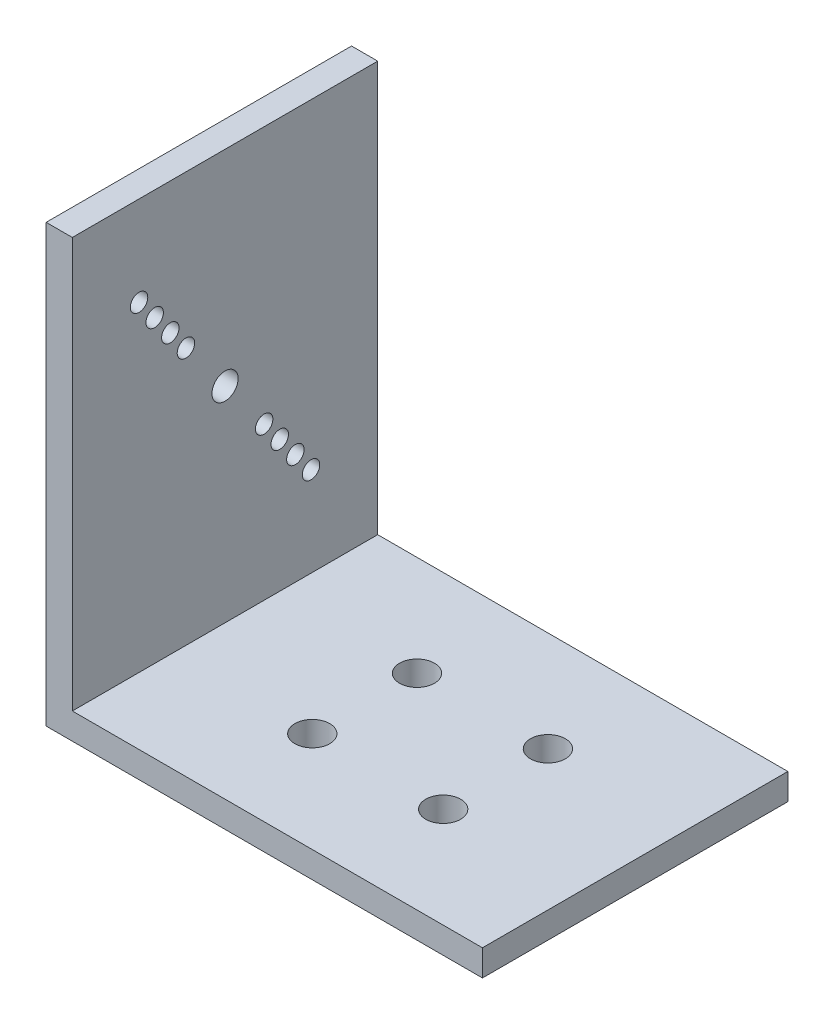
ISO-10303-21;
HEADER;
FILE_DESCRIPTION(('STEP AP214'),'2;1');
FILE_NAME('part.step','',(''),(''),'','','');
FILE_SCHEMA(('AUTOMOTIVE_DESIGN { 1 0 10303 214 1 1 1 1 }'));
ENDSEC;
DATA;
#1=APPLICATION_CONTEXT('core data for automotive mechanical design processes');
#2=APPLICATION_PROTOCOL_DEFINITION('international standard','automotive_design',2000,#1);
#3=PRODUCT_CONTEXT('',#1,'mechanical');
#4=PRODUCT('Part','Part','',(#3));
#5=PRODUCT_RELATED_PRODUCT_CATEGORY('part','',(#4));
#6=PRODUCT_DEFINITION_FORMATION('','',#4);
#7=PRODUCT_DEFINITION_CONTEXT('part definition',#1,'design');
#8=PRODUCT_DEFINITION('design','',#6,#7);
#9=PRODUCT_DEFINITION_SHAPE('','',#8);
#10=(LENGTH_UNIT() NAMED_UNIT(*) SI_UNIT(.MILLI.,.METRE.));
#11=(NAMED_UNIT(*) PLANE_ANGLE_UNIT() SI_UNIT($,.RADIAN.));
#12=(NAMED_UNIT(*) SI_UNIT($,.STERADIAN.) SOLID_ANGLE_UNIT());
#13=UNCERTAINTY_MEASURE_WITH_UNIT(LENGTH_MEASURE(1.E-05),#10,'distance_accuracy_value','');
#14=(GEOMETRIC_REPRESENTATION_CONTEXT(3) GLOBAL_UNCERTAINTY_ASSIGNED_CONTEXT((#13)) GLOBAL_UNIT_ASSIGNED_CONTEXT((#10,
#11,#12)) REPRESENTATION_CONTEXT('',''));
#15=CARTESIAN_POINT('',(0.,0.,0.));
#16=DIRECTION('',(0.,0.,1.));
#17=DIRECTION('',(1.,0.,0.));
#18=AXIS2_PLACEMENT_3D('',#15,#16,#17);
#19=CARTESIAN_POINT('',(0.,50.,35.));
#20=DIRECTION('',(0.,-1.,0.));
#21=DIRECTION('',(0.,0.,-1.));
#22=AXIS2_PLACEMENT_3D('',#19,#20,#21);
#23=PLANE('',#22);
#24=DIRECTION('',(-1.,0.,0.));
#25=VECTOR('',#24,1.);
#26=CARTESIAN_POINT('',(0.,50.,0.));
#27=LINE('',#26,#25);
#28=CARTESIAN_POINT('',(3.,50.,0.));
#29=VERTEX_POINT('',#28);
#30=CARTESIAN_POINT('',(0.,50.,0.));
#31=VERTEX_POINT('',#30);
#32=EDGE_CURVE('E122',#29,#31,#27,.T.);
#33=ORIENTED_EDGE('',*,*,#32,.T.);
#34=DIRECTION('',(0.,0.,-1.));
#35=VECTOR('',#34,1.);
#36=CARTESIAN_POINT('',(0.,50.,35.));
#37=LINE('',#36,#35);
#38=CARTESIAN_POINT('',(0.,50.,35.));
#39=VERTEX_POINT('',#38);
#40=EDGE_CURVE('E11',#39,#31,#37,.T.);
#41=ORIENTED_EDGE('',*,*,#40,.F.);
#42=DIRECTION('',(-1.,0.,0.));
#43=VECTOR('',#42,1.);
#44=CARTESIAN_POINT('',(0.,50.,35.));
#45=LINE('',#44,#43);
#46=CARTESIAN_POINT('',(3.,50.,35.));
#47=VERTEX_POINT('',#46);
#48=EDGE_CURVE('E133',#47,#39,#45,.T.);
#49=ORIENTED_EDGE('',*,*,#48,.F.);
#50=DIRECTION('',(0.,0.,-1.));
#51=VECTOR('',#50,1.);
#52=CARTESIAN_POINT('',(3.,50.,35.));
#53=LINE('',#52,#51);
#54=EDGE_CURVE('E118',#47,#29,#53,.T.);
#55=ORIENTED_EDGE('',*,*,#54,.T.);
#56=EDGE_LOOP('',(#33,#41,#49,#55));
#57=FACE_BOUND('',#56,.T.);
#58=ADVANCED_FACE('F38',(#57),#23,.F.);
#59=CARTESIAN_POINT('',(0.,50.,35.));
#60=DIRECTION('',(1.,0.,0.));
#61=DIRECTION('',(0.,0.,-1.));
#62=AXIS2_PLACEMENT_3D('',#59,#60,#61);
#63=PLANE('',#62);
#64=CARTESIAN_POINT('',(0.,20.484676672447,13.0205039050138));
#65=DIRECTION('',(1.,0.,0.));
#66=DIRECTION('',(0.,0.,-1.));
#67=AXIS2_PLACEMENT_3D('',#64,#65,#66);
#68=CIRCLE('',#67,1.);
#69=CARTESIAN_POINT('',(0.,20.484676672447,12.0205039050137));
#70=VERTEX_POINT('',#69);
#71=EDGE_CURVE('E346',#70,#70,#68,.T.);
#72=ORIENTED_EDGE('',*,*,#71,.T.);
#73=EDGE_LOOP('',(#72));
#74=FACE_BOUND('',#73,.T.);
#75=CARTESIAN_POINT('',(0.,32.515323327553,21.9794960949863));
#76=DIRECTION('',(1.,0.,0.));
#77=DIRECTION('',(0.,0.,-1.));
#78=AXIS2_PLACEMENT_3D('',#75,#76,#77);
#79=CIRCLE('',#78,1.);
#80=CARTESIAN_POINT('',(0.,32.515323327553,20.9794960949863));
#81=VERTEX_POINT('',#80);
#82=EDGE_CURVE('E348',#81,#81,#79,.T.);
#83=ORIENTED_EDGE('',*,*,#82,.T.);
#84=EDGE_LOOP('',(#83));
#85=FACE_BOUND('',#84,.T.);
#86=CARTESIAN_POINT('',(0.,34.9214526585742,23.7712945329808));
#87=DIRECTION('',(1.,0.,0.));
#88=DIRECTION('',(0.,0.,-1.));
#89=AXIS2_PLACEMENT_3D('',#86,#87,#88);
#90=CIRCLE('',#89,1.);
#91=CARTESIAN_POINT('',(0.,34.9214526585742,22.7712945329808));
#92=VERTEX_POINT('',#91);
#93=EDGE_CURVE('E354',#92,#92,#90,.T.);
#94=ORIENTED_EDGE('',*,*,#93,.T.);
#95=EDGE_LOOP('',(#94));
#96=FACE_BOUND('',#95,.T.);
#97=CARTESIAN_POINT('',(0.,37.3275819895954,25.5630929709753));
#98=DIRECTION('',(1.,0.,0.));
#99=DIRECTION('',(0.,0.,-1.));
#100=AXIS2_PLACEMENT_3D('',#97,#98,#99);
#101=CIRCLE('',#100,1.);
#102=CARTESIAN_POINT('',(0.,37.3275819895954,24.5630929709753));
#103=VERTEX_POINT('',#102);
#104=EDGE_CURVE('E397',#103,#103,#101,.T.);
#105=ORIENTED_EDGE('',*,*,#104,.T.);
#106=EDGE_LOOP('',(#105));
#107=FACE_BOUND('',#106,.T.);
#108=CARTESIAN_POINT('',(0.,39.7337113206165,27.3548914089698));
#109=DIRECTION('',(1.,0.,0.));
#110=DIRECTION('',(0.,0.,-1.));
#111=AXIS2_PLACEMENT_3D('',#108,#109,#110);
#112=CIRCLE('',#111,1.);
#113=CARTESIAN_POINT('',(0.,39.7337113206165,26.3548914089698));
#114=VERTEX_POINT('',#113);
#115=EDGE_CURVE('E400',#114,#114,#112,.T.);
#116=ORIENTED_EDGE('',*,*,#115,.T.);
#117=EDGE_LOOP('',(#116));
#118=FACE_BOUND('',#117,.T.);
#119=CARTESIAN_POINT('',(0.,18.0785473414259,11.2287054670193));
#120=DIRECTION('',(1.,0.,0.));
#121=DIRECTION('',(0.,0.,-1.));
#122=AXIS2_PLACEMENT_3D('',#119,#120,#121);
#123=CIRCLE('',#122,1.);
#124=CARTESIAN_POINT('',(0.,18.0785473414259,10.2287054670193));
#125=VERTEX_POINT('',#124);
#126=EDGE_CURVE('E403',#125,#125,#123,.T.);
#127=ORIENTED_EDGE('',*,*,#126,.T.);
#128=EDGE_LOOP('',(#127));
#129=FACE_BOUND('',#128,.T.);
#130=CARTESIAN_POINT('',(0.,15.6724180104047,9.43690702902475));
#131=DIRECTION('',(1.,0.,0.));
#132=DIRECTION('',(0.,0.,-1.));
#133=AXIS2_PLACEMENT_3D('',#130,#131,#132);
#134=CIRCLE('',#133,1.);
#135=CARTESIAN_POINT('',(0.,15.6724180104047,8.43690702902476));
#136=VERTEX_POINT('',#135);
#137=EDGE_CURVE('E406',#136,#136,#134,.T.);
#138=ORIENTED_EDGE('',*,*,#137,.T.);
#139=EDGE_LOOP('',(#138));
#140=FACE_BOUND('',#139,.T.);
#141=CARTESIAN_POINT('',(0.,13.2662886793835,7.64510859103025));
#142=DIRECTION('',(1.,0.,0.));
#143=DIRECTION('',(0.,0.,-1.));
#144=AXIS2_PLACEMENT_3D('',#141,#142,#143);
#145=CIRCLE('',#144,1.);
#146=CARTESIAN_POINT('',(0.,13.2662886793835,6.64510859103025));
#147=VERTEX_POINT('',#146);
#148=EDGE_CURVE('E409',#147,#147,#145,.T.);
#149=ORIENTED_EDGE('',*,*,#148,.T.);
#150=EDGE_LOOP('',(#149));
#151=FACE_BOUND('',#150,.T.);
#152=CARTESIAN_POINT('',(0.,26.5,17.5));
#153=DIRECTION('',(1.,0.,0.));
#154=DIRECTION('',(0.,0.,-1.));
#155=AXIS2_PLACEMENT_3D('',#152,#153,#154);
#156=CIRCLE('',#155,1.5);
#157=CARTESIAN_POINT('',(0.,26.5,16.));
#158=VERTEX_POINT('',#157);
#159=EDGE_CURVE('E412',#158,#158,#156,.T.);
#160=ORIENTED_EDGE('',*,*,#159,.T.);
#161=EDGE_LOOP('',(#160));
#162=FACE_BOUND('',#161,.T.);
#163=DIRECTION('',(0.,-1.,0.));
#164=VECTOR('',#163,1.);
#165=CARTESIAN_POINT('',(0.,50.,0.));
#166=LINE('',#165,#164);
#167=CARTESIAN_POINT('',(0.,0.,0.));
#168=VERTEX_POINT('',#167);
#169=EDGE_CURVE('E125',#31,#168,#166,.T.);
#170=ORIENTED_EDGE('',*,*,#169,.T.);
#171=DIRECTION('',(0.,0.,-1.));
#172=VECTOR('',#171,1.);
#173=CARTESIAN_POINT('',(0.,0.,35.));
#174=LINE('',#173,#172);
#175=CARTESIAN_POINT('',(0.,0.,35.));
#176=VERTEX_POINT('',#175);
#177=EDGE_CURVE('E46',#176,#168,#174,.T.);
#178=ORIENTED_EDGE('',*,*,#177,.F.);
#179=DIRECTION('',(0.,-1.,0.));
#180=VECTOR('',#179,1.);
#181=CARTESIAN_POINT('',(0.,50.,35.));
#182=LINE('',#181,#180);
#183=EDGE_CURVE('E91',#39,#176,#182,.T.);
#184=ORIENTED_EDGE('',*,*,#183,.F.);
#185=ORIENTED_EDGE('',*,*,#40,.T.);
#186=EDGE_LOOP('',(#170,#178,#184,#185));
#187=FACE_BOUND('',#186,.T.);
#188=ADVANCED_FACE('F160',(#74,#85,#96,#107,#118,#129,#140,#151,#162,#187),#63,.F.);
#189=CARTESIAN_POINT('',(0.,0.,35.));
#190=DIRECTION('',(0.,1.,0.));
#191=DIRECTION('',(0.,0.,1.));
#192=AXIS2_PLACEMENT_3D('',#189,#190,#191);
#193=PLANE('',#192);
#194=CARTESIAN_POINT('',(19.,0.,23.5));
#195=DIRECTION('',(0.,1.,0.));
#196=DIRECTION('',(0.,0.,1.));
#197=AXIS2_PLACEMENT_3D('',#194,#195,#196);
#198=CIRCLE('',#197,2.);
#199=CARTESIAN_POINT('',(19.,0.,25.5));
#200=VERTEX_POINT('',#199);
#201=EDGE_CURVE('E126',#200,#200,#198,.T.);
#202=ORIENTED_EDGE('',*,*,#201,.T.);
#203=EDGE_LOOP('',(#202));
#204=FACE_BOUND('',#203,.T.);
#205=CARTESIAN_POINT('',(34.,0.,23.5));
#206=DIRECTION('',(0.,1.,0.));
#207=DIRECTION('',(0.,0.,1.));
#208=AXIS2_PLACEMENT_3D('',#205,#206,#207);
#209=CIRCLE('',#208,2.);
#210=CARTESIAN_POINT('',(34.,0.,25.5));
#211=VERTEX_POINT('',#210);
#212=EDGE_CURVE('E372',#211,#211,#209,.T.);
#213=ORIENTED_EDGE('',*,*,#212,.T.);
#214=EDGE_LOOP('',(#213));
#215=FACE_BOUND('',#214,.T.);
#216=CARTESIAN_POINT('',(34.,0.,11.5));
#217=DIRECTION('',(0.,1.,0.));
#218=DIRECTION('',(0.,0.,1.));
#219=AXIS2_PLACEMENT_3D('',#216,#217,#218);
#220=CIRCLE('',#219,2.);
#221=CARTESIAN_POINT('',(34.,0.,13.5));
#222=VERTEX_POINT('',#221);
#223=EDGE_CURVE('E369',#222,#222,#220,.T.);
#224=ORIENTED_EDGE('',*,*,#223,.T.);
#225=EDGE_LOOP('',(#224));
#226=FACE_BOUND('',#225,.T.);
#227=CARTESIAN_POINT('',(19.,0.,11.5));
#228=DIRECTION('',(0.,1.,0.));
#229=DIRECTION('',(0.,0.,1.));
#230=AXIS2_PLACEMENT_3D('',#227,#228,#229);
#231=CIRCLE('',#230,2.00000000000001);
#232=CARTESIAN_POINT('',(19.,0.,13.5));
#233=VERTEX_POINT('',#232);
#234=EDGE_CURVE('E366',#233,#233,#231,.T.);
#235=ORIENTED_EDGE('',*,*,#234,.T.);
#236=EDGE_LOOP('',(#235));
#237=FACE_BOUND('',#236,.T.);
#238=DIRECTION('',(1.,0.,0.));
#239=VECTOR('',#238,1.);
#240=CARTESIAN_POINT('',(0.,0.,0.));
#241=LINE('',#240,#239);
#242=CARTESIAN_POINT('',(50.,0.,0.));
#243=VERTEX_POINT('',#242);
#244=EDGE_CURVE('E128',#168,#243,#241,.T.);
#245=ORIENTED_EDGE('',*,*,#244,.T.);
#246=DIRECTION('',(0.,0.,-1.));
#247=VECTOR('',#246,1.);
#248=CARTESIAN_POINT('',(50.,0.,35.));
#249=LINE('',#248,#247);
#250=CARTESIAN_POINT('',(50.,0.,35.));
#251=VERTEX_POINT('',#250);
#252=EDGE_CURVE('E113',#251,#243,#249,.T.);
#253=ORIENTED_EDGE('',*,*,#252,.F.);
#254=DIRECTION('',(1.,0.,0.));
#255=VECTOR('',#254,1.);
#256=CARTESIAN_POINT('',(0.,0.,35.));
#257=LINE('',#256,#255);
#258=EDGE_CURVE('E104',#176,#251,#257,.T.);
#259=ORIENTED_EDGE('',*,*,#258,.F.);
#260=ORIENTED_EDGE('',*,*,#177,.T.);
#261=EDGE_LOOP('',(#245,#253,#259,#260));
#262=FACE_BOUND('',#261,.T.);
#263=ADVANCED_FACE('F139',(#204,#215,#226,#237,#262),#193,.F.);
#264=CARTESIAN_POINT('',(50.,0.,35.));
#265=DIRECTION('',(-1.,0.,0.));
#266=DIRECTION('',(0.,0.,1.));
#267=AXIS2_PLACEMENT_3D('',#264,#265,#266);
#268=PLANE('',#267);
#269=DIRECTION('',(0.,1.,0.));
#270=VECTOR('',#269,1.);
#271=CARTESIAN_POINT('',(50.,0.,0.));
#272=LINE('',#271,#270);
#273=CARTESIAN_POINT('',(50.,3.,0.));
#274=VERTEX_POINT('',#273);
#275=EDGE_CURVE('E112',#243,#274,#272,.T.);
#276=ORIENTED_EDGE('',*,*,#275,.T.);
#277=DIRECTION('',(0.,0.,-1.));
#278=VECTOR('',#277,1.);
#279=CARTESIAN_POINT('',(50.,3.,35.));
#280=LINE('',#279,#278);
#281=CARTESIAN_POINT('',(50.,3.,35.));
#282=VERTEX_POINT('',#281);
#283=EDGE_CURVE('E109',#282,#274,#280,.T.);
#284=ORIENTED_EDGE('',*,*,#283,.F.);
#285=DIRECTION('',(0.,1.,0.));
#286=VECTOR('',#285,1.);
#287=CARTESIAN_POINT('',(50.,0.,35.));
#288=LINE('',#287,#286);
#289=EDGE_CURVE('E98',#251,#282,#288,.T.);
#290=ORIENTED_EDGE('',*,*,#289,.F.);
#291=ORIENTED_EDGE('',*,*,#252,.T.);
#292=EDGE_LOOP('',(#276,#284,#290,#291));
#293=FACE_BOUND('',#292,.T.);
#294=ADVANCED_FACE('F110',(#293),#268,.F.);
#295=CARTESIAN_POINT('',(3.,3.,35.));
#296=DIRECTION('',(0.,-1.,0.));
#297=DIRECTION('',(0.,0.,-1.));
#298=AXIS2_PLACEMENT_3D('',#295,#296,#297);
#299=PLANE('',#298);
#300=CARTESIAN_POINT('',(19.,3.,23.5));
#301=DIRECTION('',(0.,1.,0.));
#302=DIRECTION('',(0.,0.,1.));
#303=AXIS2_PLACEMENT_3D('',#300,#301,#302);
#304=CIRCLE('',#303,2.);
#305=CARTESIAN_POINT('',(19.,3.,25.5));
#306=VERTEX_POINT('',#305);
#307=EDGE_CURVE('E347',#306,#306,#304,.T.);
#308=ORIENTED_EDGE('',*,*,#307,.F.);
#309=EDGE_LOOP('',(#308));
#310=FACE_BOUND('',#309,.T.);
#311=CARTESIAN_POINT('',(34.,3.,23.5));
#312=DIRECTION('',(0.,1.,0.));
#313=DIRECTION('',(0.,0.,1.));
#314=AXIS2_PLACEMENT_3D('',#311,#312,#313);
#315=CIRCLE('',#314,2.);
#316=CARTESIAN_POINT('',(34.,3.,25.5));
#317=VERTEX_POINT('',#316);
#318=EDGE_CURVE('E351',#317,#317,#315,.T.);
#319=ORIENTED_EDGE('',*,*,#318,.F.);
#320=EDGE_LOOP('',(#319));
#321=FACE_BOUND('',#320,.T.);
#322=CARTESIAN_POINT('',(34.,3.,11.5));
#323=DIRECTION('',(0.,1.,0.));
#324=DIRECTION('',(0.,0.,1.));
#325=AXIS2_PLACEMENT_3D('',#322,#323,#324);
#326=CIRCLE('',#325,2.);
#327=CARTESIAN_POINT('',(34.,3.,13.5));
#328=VERTEX_POINT('',#327);
#329=EDGE_CURVE('E358',#328,#328,#326,.T.);
#330=ORIENTED_EDGE('',*,*,#329,.F.);
#331=EDGE_LOOP('',(#330));
#332=FACE_BOUND('',#331,.T.);
#333=CARTESIAN_POINT('',(19.,3.,11.5));
#334=DIRECTION('',(0.,1.,0.));
#335=DIRECTION('',(0.,0.,1.));
#336=AXIS2_PLACEMENT_3D('',#333,#334,#335);
#337=CIRCLE('',#336,2.00000000000001);
#338=CARTESIAN_POINT('',(19.,3.,13.5));
#339=VERTEX_POINT('',#338);
#340=EDGE_CURVE('E361',#339,#339,#337,.T.);
#341=ORIENTED_EDGE('',*,*,#340,.F.);
#342=EDGE_LOOP('',(#341));
#343=FACE_BOUND('',#342,.T.);
#344=DIRECTION('',(-1.,0.,0.));
#345=VECTOR('',#344,1.);
#346=CARTESIAN_POINT('',(3.,3.,0.));
#347=LINE('',#346,#345);
#348=CARTESIAN_POINT('',(3.,3.,0.));
#349=VERTEX_POINT('',#348);
#350=EDGE_CURVE('E77',#274,#349,#347,.T.);
#351=ORIENTED_EDGE('',*,*,#350,.T.);
#352=DIRECTION('',(0.,0.,-1.));
#353=VECTOR('',#352,1.);
#354=CARTESIAN_POINT('',(3.,3.,35.));
#355=LINE('',#354,#353);
#356=CARTESIAN_POINT('',(3.,3.,35.));
#357=VERTEX_POINT('',#356);
#358=EDGE_CURVE('E114',#357,#349,#355,.T.);
#359=ORIENTED_EDGE('',*,*,#358,.F.);
#360=DIRECTION('',(-1.,0.,0.));
#361=VECTOR('',#360,1.);
#362=CARTESIAN_POINT('',(3.,3.,35.));
#363=LINE('',#362,#361);
#364=EDGE_CURVE('E102',#282,#357,#363,.T.);
#365=ORIENTED_EDGE('',*,*,#364,.F.);
#366=ORIENTED_EDGE('',*,*,#283,.T.);
#367=EDGE_LOOP('',(#351,#359,#365,#366));
#368=FACE_BOUND('',#367,.T.);
#369=ADVANCED_FACE('F116',(#310,#321,#332,#343,#368),#299,.F.);
#370=CARTESIAN_POINT('',(3.,50.,35.));
#371=DIRECTION('',(-1.,0.,0.));
#372=DIRECTION('',(0.,0.,1.));
#373=AXIS2_PLACEMENT_3D('',#370,#371,#372);
#374=PLANE('',#373);
#375=CARTESIAN_POINT('',(3.,20.484676672447,13.0205039050138));
#376=DIRECTION('',(1.,0.,0.));
#377=DIRECTION('',(0.,0.,-1.));
#378=AXIS2_PLACEMENT_3D('',#375,#376,#377);
#379=CIRCLE('',#378,1.);
#380=CARTESIAN_POINT('',(3.,20.484676672447,12.0205039050137));
#381=VERTEX_POINT('',#380);
#382=EDGE_CURVE('E344',#381,#381,#379,.T.);
#383=ORIENTED_EDGE('',*,*,#382,.F.);
#384=EDGE_LOOP('',(#383));
#385=FACE_BOUND('',#384,.T.);
#386=CARTESIAN_POINT('',(3.,32.515323327553,21.9794960949863));
#387=DIRECTION('',(1.,0.,0.));
#388=DIRECTION('',(0.,0.,-1.));
#389=AXIS2_PLACEMENT_3D('',#386,#387,#388);
#390=CIRCLE('',#389,1.);
#391=CARTESIAN_POINT('',(3.,32.515323327553,20.9794960949863));
#392=VERTEX_POINT('',#391);
#393=EDGE_CURVE('E425',#392,#392,#390,.T.);
#394=ORIENTED_EDGE('',*,*,#393,.F.);
#395=EDGE_LOOP('',(#394));
#396=FACE_BOUND('',#395,.T.);
#397=CARTESIAN_POINT('',(3.,34.9214526585742,23.7712945329808));
#398=DIRECTION('',(1.,0.,0.));
#399=DIRECTION('',(0.,0.,-1.));
#400=AXIS2_PLACEMENT_3D('',#397,#398,#399);
#401=CIRCLE('',#400,1.);
#402=CARTESIAN_POINT('',(3.,34.9214526585742,22.7712945329808));
#403=VERTEX_POINT('',#402);
#404=EDGE_CURVE('E421',#403,#403,#401,.T.);
#405=ORIENTED_EDGE('',*,*,#404,.F.);
#406=EDGE_LOOP('',(#405));
#407=FACE_BOUND('',#406,.T.);
#408=CARTESIAN_POINT('',(3.,37.3275819895954,25.5630929709753));
#409=DIRECTION('',(1.,0.,0.));
#410=DIRECTION('',(0.,0.,-1.));
#411=AXIS2_PLACEMENT_3D('',#408,#409,#410);
#412=CIRCLE('',#411,1.);
#413=CARTESIAN_POINT('',(3.,37.3275819895954,24.5630929709753));
#414=VERTEX_POINT('',#413);
#415=EDGE_CURVE('E418',#414,#414,#412,.T.);
#416=ORIENTED_EDGE('',*,*,#415,.F.);
#417=EDGE_LOOP('',(#416));
#418=FACE_BOUND('',#417,.T.);
#419=CARTESIAN_POINT('',(3.,39.7337113206165,27.3548914089698));
#420=DIRECTION('',(1.,0.,0.));
#421=DIRECTION('',(0.,0.,-1.));
#422=AXIS2_PLACEMENT_3D('',#419,#420,#421);
#423=CIRCLE('',#422,1.);
#424=CARTESIAN_POINT('',(3.,39.7337113206165,26.3548914089698));
#425=VERTEX_POINT('',#424);
#426=EDGE_CURVE('E422',#425,#425,#423,.T.);
#427=ORIENTED_EDGE('',*,*,#426,.F.);
#428=EDGE_LOOP('',(#427));
#429=FACE_BOUND('',#428,.T.);
#430=CARTESIAN_POINT('',(3.,18.0785473414259,11.2287054670193));
#431=DIRECTION('',(1.,0.,0.));
#432=DIRECTION('',(0.,0.,-1.));
#433=AXIS2_PLACEMENT_3D('',#430,#431,#432);
#434=CIRCLE('',#433,1.);
#435=CARTESIAN_POINT('',(3.,18.0785473414259,10.2287054670193));
#436=VERTEX_POINT('',#435);
#437=EDGE_CURVE('E435',#436,#436,#434,.T.);
#438=ORIENTED_EDGE('',*,*,#437,.F.);
#439=EDGE_LOOP('',(#438));
#440=FACE_BOUND('',#439,.T.);
#441=CARTESIAN_POINT('',(3.,15.6724180104047,9.43690702902475));
#442=DIRECTION('',(1.,0.,0.));
#443=DIRECTION('',(0.,0.,-1.));
#444=AXIS2_PLACEMENT_3D('',#441,#442,#443);
#445=CIRCLE('',#444,1.);
#446=CARTESIAN_POINT('',(3.,15.6724180104047,8.43690702902476));
#447=VERTEX_POINT('',#446);
#448=EDGE_CURVE('E432',#447,#447,#445,.T.);
#449=ORIENTED_EDGE('',*,*,#448,.F.);
#450=EDGE_LOOP('',(#449));
#451=FACE_BOUND('',#450,.T.);
#452=CARTESIAN_POINT('',(3.,13.2662886793835,7.64510859103025));
#453=DIRECTION('',(1.,0.,0.));
#454=DIRECTION('',(0.,0.,-1.));
#455=AXIS2_PLACEMENT_3D('',#452,#453,#454);
#456=CIRCLE('',#455,1.);
#457=CARTESIAN_POINT('',(3.,13.2662886793835,6.64510859103025));
#458=VERTEX_POINT('',#457);
#459=EDGE_CURVE('E429',#458,#458,#456,.T.);
#460=ORIENTED_EDGE('',*,*,#459,.F.);
#461=EDGE_LOOP('',(#460));
#462=FACE_BOUND('',#461,.T.);
#463=CARTESIAN_POINT('',(3.,26.5,17.5));
#464=DIRECTION('',(1.,0.,0.));
#465=DIRECTION('',(0.,0.,-1.));
#466=AXIS2_PLACEMENT_3D('',#463,#464,#465);
#467=CIRCLE('',#466,1.5);
#468=CARTESIAN_POINT('',(3.,26.5,16.));
#469=VERTEX_POINT('',#468);
#470=EDGE_CURVE('E415',#469,#469,#467,.T.);
#471=ORIENTED_EDGE('',*,*,#470,.F.);
#472=EDGE_LOOP('',(#471));
#473=FACE_BOUND('',#472,.T.);
#474=DIRECTION('',(0.,1.,0.));
#475=VECTOR('',#474,1.);
#476=CARTESIAN_POINT('',(3.,50.,0.));
#477=LINE('',#476,#475);
#478=EDGE_CURVE('E83',#349,#29,#477,.T.);
#479=ORIENTED_EDGE('',*,*,#478,.T.);
#480=ORIENTED_EDGE('',*,*,#54,.F.);
#481=DIRECTION('',(0.,1.,0.));
#482=VECTOR('',#481,1.);
#483=CARTESIAN_POINT('',(3.,50.,35.));
#484=LINE('',#483,#482);
#485=EDGE_CURVE('E54',#357,#47,#484,.T.);
#486=ORIENTED_EDGE('',*,*,#485,.F.);
#487=ORIENTED_EDGE('',*,*,#358,.T.);
#488=EDGE_LOOP('',(#479,#480,#486,#487));
#489=FACE_BOUND('',#488,.T.);
#490=ADVANCED_FACE('F146',(#385,#396,#407,#418,#429,#440,#451,#462,#473,#489),#374,.F.);
#491=CARTESIAN_POINT('',(0.,0.,35.));
#492=DIRECTION('',(0.,0.,-1.));
#493=DIRECTION('',(-1.,0.,0.));
#494=AXIS2_PLACEMENT_3D('',#491,#492,#493);
#495=PLANE('',#494);
#496=ORIENTED_EDGE('',*,*,#48,.T.);
#497=ORIENTED_EDGE('',*,*,#183,.T.);
#498=ORIENTED_EDGE('',*,*,#258,.T.);
#499=ORIENTED_EDGE('',*,*,#289,.T.);
#500=ORIENTED_EDGE('',*,*,#364,.T.);
#501=ORIENTED_EDGE('',*,*,#485,.T.);
#502=EDGE_LOOP('',(#496,#497,#498,#499,#500,#501));
#503=FACE_BOUND('',#502,.T.);
#504=ADVANCED_FACE('F100',(#503),#495,.F.);
#505=CARTESIAN_POINT('',(0.,0.,0.));
#506=DIRECTION('',(0.,0.,-1.));
#507=DIRECTION('',(-1.,0.,0.));
#508=AXIS2_PLACEMENT_3D('',#505,#506,#507);
#509=PLANE('',#508);
#510=ORIENTED_EDGE('',*,*,#32,.F.);
#511=ORIENTED_EDGE('',*,*,#478,.F.);
#512=ORIENTED_EDGE('',*,*,#350,.F.);
#513=ORIENTED_EDGE('',*,*,#275,.F.);
#514=ORIENTED_EDGE('',*,*,#244,.F.);
#515=ORIENTED_EDGE('',*,*,#169,.F.);
#516=EDGE_LOOP('',(#510,#511,#512,#513,#514,#515));
#517=FACE_BOUND('',#516,.T.);
#518=ADVANCED_FACE('F142',(#517),#509,.T.);
#519=CARTESIAN_POINT('',(19.,-47.,11.5));
#520=DIRECTION('',(0.,1.,0.));
#521=DIRECTION('',(0.,0.,1.));
#522=AXIS2_PLACEMENT_3D('',#519,#520,#521);
#523=CYLINDRICAL_SURFACE('',#522,2.00000000000001);
#524=ORIENTED_EDGE('',*,*,#340,.T.);
#525=EDGE_LOOP('',(#524));
#526=FACE_BOUND('',#525,.T.);
#527=ORIENTED_EDGE('',*,*,#234,.F.);
#528=EDGE_LOOP('',(#527));
#529=FACE_BOUND('',#528,.T.);
#530=ADVANCED_FACE('F192',(#526,#529),#523,.F.);
#531=CARTESIAN_POINT('',(34.,-47.,11.5));
#532=DIRECTION('',(0.,1.,0.));
#533=DIRECTION('',(0.,0.,1.));
#534=AXIS2_PLACEMENT_3D('',#531,#532,#533);
#535=CYLINDRICAL_SURFACE('',#534,2.);
#536=ORIENTED_EDGE('',*,*,#329,.T.);
#537=EDGE_LOOP('',(#536));
#538=FACE_BOUND('',#537,.T.);
#539=ORIENTED_EDGE('',*,*,#223,.F.);
#540=EDGE_LOOP('',(#539));
#541=FACE_BOUND('',#540,.T.);
#542=ADVANCED_FACE('F197',(#538,#541),#535,.F.);
#543=CARTESIAN_POINT('',(34.,-47.,23.5));
#544=DIRECTION('',(0.,1.,0.));
#545=DIRECTION('',(0.,0.,1.));
#546=AXIS2_PLACEMENT_3D('',#543,#544,#545);
#547=CYLINDRICAL_SURFACE('',#546,2.);
#548=ORIENTED_EDGE('',*,*,#318,.T.);
#549=EDGE_LOOP('',(#548));
#550=FACE_BOUND('',#549,.T.);
#551=ORIENTED_EDGE('',*,*,#212,.F.);
#552=EDGE_LOOP('',(#551));
#553=FACE_BOUND('',#552,.T.);
#554=ADVANCED_FACE('F209',(#550,#553),#547,.F.);
#555=CARTESIAN_POINT('',(19.,-47.,23.5));
#556=DIRECTION('',(0.,1.,0.));
#557=DIRECTION('',(0.,0.,1.));
#558=AXIS2_PLACEMENT_3D('',#555,#556,#557);
#559=CYLINDRICAL_SURFACE('',#558,2.);
#560=ORIENTED_EDGE('',*,*,#307,.T.);
#561=EDGE_LOOP('',(#560));
#562=FACE_BOUND('',#561,.T.);
#563=ORIENTED_EDGE('',*,*,#201,.F.);
#564=EDGE_LOOP('',(#563));
#565=FACE_BOUND('',#564,.T.);
#566=ADVANCED_FACE('F219',(#562,#565),#559,.F.);
#567=CARTESIAN_POINT('',(-47.,26.5,17.5));
#568=DIRECTION('',(1.,0.,0.));
#569=DIRECTION('',(0.,0.,-1.));
#570=AXIS2_PLACEMENT_3D('',#567,#568,#569);
#571=CYLINDRICAL_SURFACE('',#570,1.5);
#572=ORIENTED_EDGE('',*,*,#470,.T.);
#573=EDGE_LOOP('',(#572));
#574=FACE_BOUND('',#573,.T.);
#575=ORIENTED_EDGE('',*,*,#159,.F.);
#576=EDGE_LOOP('',(#575));
#577=FACE_BOUND('',#576,.T.);
#578=ADVANCED_FACE('F228',(#574,#577),#571,.F.);
#579=CARTESIAN_POINT('',(-47.,13.2662886793835,7.64510859103025));
#580=DIRECTION('',(1.,0.,0.));
#581=DIRECTION('',(0.,0.,-1.));
#582=AXIS2_PLACEMENT_3D('',#579,#580,#581);
#583=CYLINDRICAL_SURFACE('',#582,1.);
#584=ORIENTED_EDGE('',*,*,#459,.T.);
#585=EDGE_LOOP('',(#584));
#586=FACE_BOUND('',#585,.T.);
#587=ORIENTED_EDGE('',*,*,#148,.F.);
#588=EDGE_LOOP('',(#587));
#589=FACE_BOUND('',#588,.T.);
#590=ADVANCED_FACE('F250',(#586,#589),#583,.F.);
#591=CARTESIAN_POINT('',(-47.,15.6724180104047,9.43690702902475));
#592=DIRECTION('',(1.,0.,0.));
#593=DIRECTION('',(0.,0.,-1.));
#594=AXIS2_PLACEMENT_3D('',#591,#592,#593);
#595=CYLINDRICAL_SURFACE('',#594,1.);
#596=ORIENTED_EDGE('',*,*,#448,.T.);
#597=EDGE_LOOP('',(#596));
#598=FACE_BOUND('',#597,.T.);
#599=ORIENTED_EDGE('',*,*,#137,.F.);
#600=EDGE_LOOP('',(#599));
#601=FACE_BOUND('',#600,.T.);
#602=ADVANCED_FACE('F260',(#598,#601),#595,.F.);
#603=CARTESIAN_POINT('',(-47.,18.0785473414259,11.2287054670193));
#604=DIRECTION('',(1.,0.,0.));
#605=DIRECTION('',(0.,0.,-1.));
#606=AXIS2_PLACEMENT_3D('',#603,#604,#605);
#607=CYLINDRICAL_SURFACE('',#606,1.);
#608=ORIENTED_EDGE('',*,*,#437,.T.);
#609=EDGE_LOOP('',(#608));
#610=FACE_BOUND('',#609,.T.);
#611=ORIENTED_EDGE('',*,*,#126,.F.);
#612=EDGE_LOOP('',(#611));
#613=FACE_BOUND('',#612,.T.);
#614=ADVANCED_FACE('F270',(#610,#613),#607,.F.);
#615=CARTESIAN_POINT('',(-47.,39.7337113206165,27.3548914089698));
#616=DIRECTION('',(1.,0.,0.));
#617=DIRECTION('',(0.,0.,-1.));
#618=AXIS2_PLACEMENT_3D('',#615,#616,#617);
#619=CYLINDRICAL_SURFACE('',#618,1.);
#620=ORIENTED_EDGE('',*,*,#426,.T.);
#621=EDGE_LOOP('',(#620));
#622=FACE_BOUND('',#621,.T.);
#623=ORIENTED_EDGE('',*,*,#115,.F.);
#624=EDGE_LOOP('',(#623));
#625=FACE_BOUND('',#624,.T.);
#626=ADVANCED_FACE('F280',(#622,#625),#619,.F.);
#627=CARTESIAN_POINT('',(-47.,37.3275819895954,25.5630929709753));
#628=DIRECTION('',(1.,0.,0.));
#629=DIRECTION('',(0.,0.,-1.));
#630=AXIS2_PLACEMENT_3D('',#627,#628,#629);
#631=CYLINDRICAL_SURFACE('',#630,1.);
#632=ORIENTED_EDGE('',*,*,#415,.T.);
#633=EDGE_LOOP('',(#632));
#634=FACE_BOUND('',#633,.T.);
#635=ORIENTED_EDGE('',*,*,#104,.F.);
#636=EDGE_LOOP('',(#635));
#637=FACE_BOUND('',#636,.T.);
#638=ADVANCED_FACE('F290',(#634,#637),#631,.F.);
#639=CARTESIAN_POINT('',(-47.,34.9214526585742,23.7712945329808));
#640=DIRECTION('',(1.,0.,0.));
#641=DIRECTION('',(0.,0.,-1.));
#642=AXIS2_PLACEMENT_3D('',#639,#640,#641);
#643=CYLINDRICAL_SURFACE('',#642,1.);
#644=ORIENTED_EDGE('',*,*,#404,.T.);
#645=EDGE_LOOP('',(#644));
#646=FACE_BOUND('',#645,.T.);
#647=ORIENTED_EDGE('',*,*,#93,.F.);
#648=EDGE_LOOP('',(#647));
#649=FACE_BOUND('',#648,.T.);
#650=ADVANCED_FACE('F300',(#646,#649),#643,.F.);
#651=CARTESIAN_POINT('',(-47.,32.515323327553,21.9794960949863));
#652=DIRECTION('',(1.,0.,0.));
#653=DIRECTION('',(0.,0.,-1.));
#654=AXIS2_PLACEMENT_3D('',#651,#652,#653);
#655=CYLINDRICAL_SURFACE('',#654,1.);
#656=ORIENTED_EDGE('',*,*,#393,.T.);
#657=EDGE_LOOP('',(#656));
#658=FACE_BOUND('',#657,.T.);
#659=ORIENTED_EDGE('',*,*,#82,.F.);
#660=EDGE_LOOP('',(#659));
#661=FACE_BOUND('',#660,.T.);
#662=ADVANCED_FACE('F310',(#658,#661),#655,.F.);
#663=CARTESIAN_POINT('',(-47.,20.484676672447,13.0205039050138));
#664=DIRECTION('',(1.,0.,0.));
#665=DIRECTION('',(0.,0.,-1.));
#666=AXIS2_PLACEMENT_3D('',#663,#664,#665);
#667=CYLINDRICAL_SURFACE('',#666,1.);
#668=ORIENTED_EDGE('',*,*,#382,.T.);
#669=EDGE_LOOP('',(#668));
#670=FACE_BOUND('',#669,.T.);
#671=ORIENTED_EDGE('',*,*,#71,.F.);
#672=EDGE_LOOP('',(#671));
#673=FACE_BOUND('',#672,.T.);
#674=ADVANCED_FACE('F320',(#670,#673),#667,.F.);
#675=CLOSED_SHELL('',(#58,#188,#263,#294,#369,#490,#504,#518,#530,#542,#554,#566,#578,#590,#602,
#614,#626,#638,#650,#662,#674));
#676=MANIFOLD_SOLID_BREP('B2',#675);
#677=ADVANCED_BREP_SHAPE_REPRESENTATION('',(#18,#676),#14);
#678=SHAPE_DEFINITION_REPRESENTATION(#9,#677);
ENDSEC;
END-ISO-10303-21;
